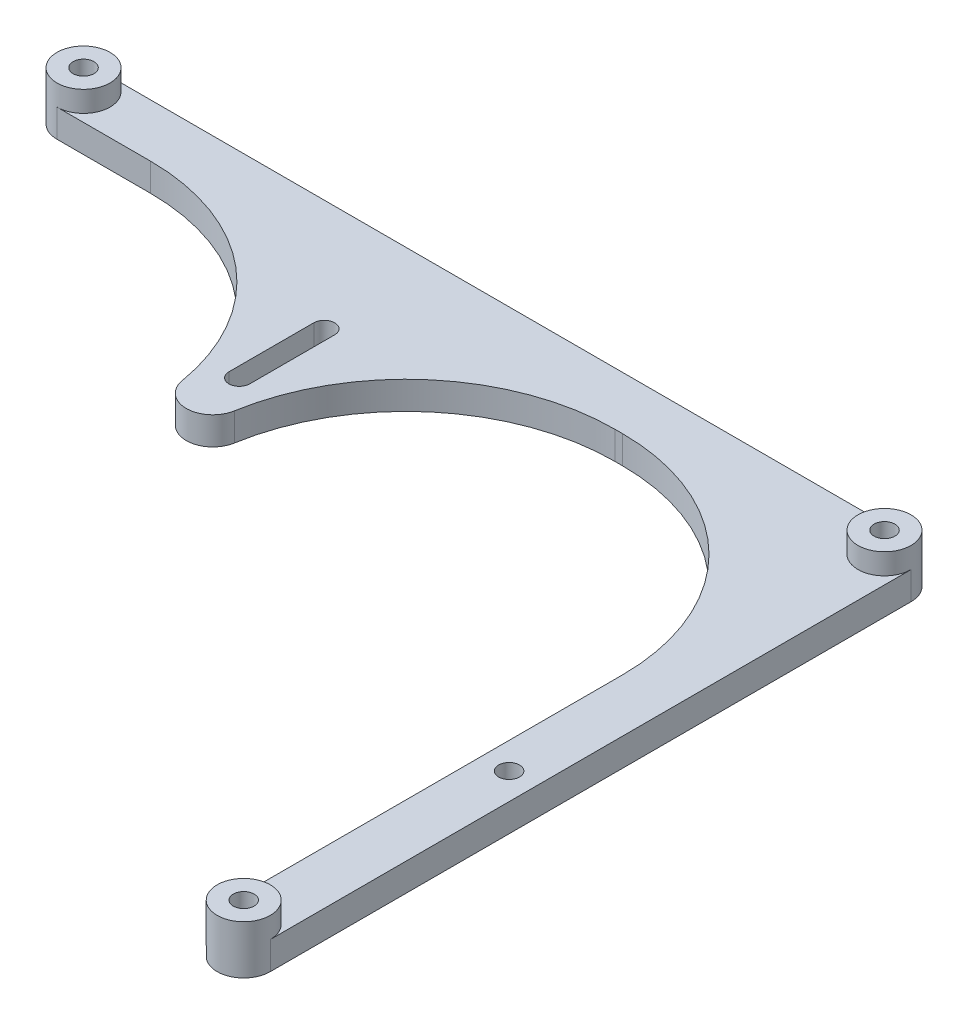
ISO-10303-21;
HEADER;
FILE_DESCRIPTION(('STEP AP214'),'2;1');
FILE_NAME('part.step','',(''),(''),'','','');
FILE_SCHEMA(('AUTOMOTIVE_DESIGN { 1 0 10303 214 1 1 1 1 }'));
ENDSEC;
DATA;
#1=APPLICATION_CONTEXT('core data for automotive mechanical design processes');
#2=APPLICATION_PROTOCOL_DEFINITION('international standard','automotive_design',2000,#1);
#3=PRODUCT_CONTEXT('',#1,'mechanical');
#4=PRODUCT('Part','Part','',(#3));
#5=PRODUCT_RELATED_PRODUCT_CATEGORY('part','',(#4));
#6=PRODUCT_DEFINITION_FORMATION('','',#4);
#7=PRODUCT_DEFINITION_CONTEXT('part definition',#1,'design');
#8=PRODUCT_DEFINITION('design','',#6,#7);
#9=PRODUCT_DEFINITION_SHAPE('','',#8);
#10=(LENGTH_UNIT() NAMED_UNIT(*) SI_UNIT(.MILLI.,.METRE.));
#11=(NAMED_UNIT(*) PLANE_ANGLE_UNIT() SI_UNIT($,.RADIAN.));
#12=(NAMED_UNIT(*) SI_UNIT($,.STERADIAN.) SOLID_ANGLE_UNIT());
#13=UNCERTAINTY_MEASURE_WITH_UNIT(LENGTH_MEASURE(1.E-05),#10,'distance_accuracy_value','');
#14=(GEOMETRIC_REPRESENTATION_CONTEXT(3) GLOBAL_UNCERTAINTY_ASSIGNED_CONTEXT((#13)) GLOBAL_UNIT_ASSIGNED_CONTEXT((#10,
#11,#12)) REPRESENTATION_CONTEXT('',''));
#15=CARTESIAN_POINT('',(0.,0.,0.));
#16=DIRECTION('',(0.,0.,1.));
#17=DIRECTION('',(1.,0.,0.));
#18=AXIS2_PLACEMENT_3D('',#15,#16,#17);
#19=CARTESIAN_POINT('',(0.,4.,0.));
#20=DIRECTION('',(0.,1.,0.));
#21=DIRECTION('',(0.,0.,1.));
#22=AXIS2_PLACEMENT_3D('',#19,#20,#21);
#23=PLANE('',#22);
#24=CARTESIAN_POINT('',(0.,4.,7.89999999999999));
#25=DIRECTION('',(0.,1.,0.));
#26=DIRECTION('',(0.,0.,1.));
#27=AXIS2_PLACEMENT_3D('',#24,#25,#26);
#28=CIRCLE('',#27,1.5);
#29=CARTESIAN_POINT('',(0.,4.,9.4));
#30=VERTEX_POINT('',#29);
#31=EDGE_CURVE('E157',#30,#30,#28,.T.);
#32=ORIENTED_EDGE('',*,*,#31,.F.);
#33=EDGE_LOOP('',(#32));
#34=FACE_BOUND('',#33,.T.);
#35=DIRECTION('',(0.,0.,1.));
#36=VECTOR('',#35,1.);
#37=CARTESIAN_POINT('',(-66.75,4.,0.));
#38=LINE('',#37,#36);
#39=CARTESIAN_POINT('',(-66.75,4.,-33.81));
#40=VERTEX_POINT('',#39);
#41=CARTESIAN_POINT('',(-66.75,4.,-21.62));
#42=VERTEX_POINT('',#41);
#43=EDGE_CURVE('E194',#40,#42,#38,.T.);
#44=ORIENTED_EDGE('',*,*,#43,.T.);
#45=CARTESIAN_POINT('',(-68.25,4.,-21.62));
#46=DIRECTION('',(0.,1.,0.));
#47=DIRECTION('',(0.,0.,1.));
#48=AXIS2_PLACEMENT_3D('',#45,#46,#47);
#49=CIRCLE('',#48,1.5);
#50=CARTESIAN_POINT('',(-69.75,4.,-21.62));
#51=VERTEX_POINT('',#50);
#52=EDGE_CURVE('E196',#51,#42,#49,.T.);
#53=ORIENTED_EDGE('',*,*,#52,.F.);
#54=DIRECTION('',(0.,0.,1.));
#55=VECTOR('',#54,1.);
#56=CARTESIAN_POINT('',(-69.75,4.,0.));
#57=LINE('',#56,#55);
#58=CARTESIAN_POINT('',(-69.75,4.,-33.81));
#59=VERTEX_POINT('',#58);
#60=EDGE_CURVE('E200',#59,#51,#57,.T.);
#61=ORIENTED_EDGE('',*,*,#60,.F.);
#62=CARTESIAN_POINT('',(-68.25,4.,-33.81));
#63=DIRECTION('',(0.,1.,0.));
#64=DIRECTION('',(0.,0.,1.));
#65=AXIS2_PLACEMENT_3D('',#62,#63,#64);
#66=CIRCLE('',#65,1.5);
#67=EDGE_CURVE('E203',#40,#59,#66,.T.);
#68=ORIENTED_EDGE('',*,*,#67,.F.);
#69=EDGE_LOOP('',(#44,#53,#61,#68));
#70=FACE_BOUND('',#69,.T.);
#71=DIRECTION('',(0.,0.,-1.));
#72=VECTOR('',#71,1.);
#73=CARTESIAN_POINT('',(-3.81,4.,0.));
#74=LINE('',#73,#72);
#75=CARTESIAN_POINT('',(-3.81,4.,46.));
#76=VERTEX_POINT('',#75);
#77=CARTESIAN_POINT('',(-3.81,4.,-12.19));
#78=VERTEX_POINT('',#77);
#79=EDGE_CURVE('E158',#76,#78,#74,.T.);
#80=ORIENTED_EDGE('',*,*,#79,.F.);
#81=CARTESIAN_POINT('',(0.,4.,46.));
#82=DIRECTION('',(0.,1.,0.));
#83=DIRECTION('',(0.,0.,1.));
#84=AXIS2_PLACEMENT_3D('',#81,#82,#83);
#85=CIRCLE('',#84,3.80999999999999);
#86=CARTESIAN_POINT('',(3.81,4.,46.));
#87=VERTEX_POINT('',#86);
#88=EDGE_CURVE('E164',#76,#87,#85,.F.);
#89=ORIENTED_EDGE('',*,*,#88,.T.);
#90=DIRECTION('',(0.,0.,-1.));
#91=VECTOR('',#90,1.);
#92=CARTESIAN_POINT('',(3.81,4.,0.));
#93=LINE('',#92,#91);
#94=CARTESIAN_POINT('',(3.81,4.,-46.));
#95=VERTEX_POINT('',#94);
#96=EDGE_CURVE('E149',#87,#95,#93,.T.);
#97=ORIENTED_EDGE('',*,*,#96,.T.);
#98=CARTESIAN_POINT('',(0.,4.,-46.));
#99=DIRECTION('',(0.,1.,0.));
#100=DIRECTION('',(0.,0.,1.));
#101=AXIS2_PLACEMENT_3D('',#98,#99,#100);
#102=CIRCLE('',#101,3.81);
#103=CARTESIAN_POINT('',(0.,4.,-49.81));
#104=VERTEX_POINT('',#103);
#105=EDGE_CURVE('E182',#95,#104,#102,.F.);
#106=ORIENTED_EDGE('',*,*,#105,.T.);
#107=DIRECTION('',(-1.,0.,0.));
#108=VECTOR('',#107,1.);
#109=CARTESIAN_POINT('',(0.,4.,-49.81));
#110=LINE('',#109,#108);
#111=CARTESIAN_POINT('',(-115.,4.,-49.81));
#112=VERTEX_POINT('',#111);
#113=EDGE_CURVE('E206',#104,#112,#110,.T.);
#114=ORIENTED_EDGE('',*,*,#113,.T.);
#115=CARTESIAN_POINT('',(-115.,4.,-46.));
#116=DIRECTION('',(0.,1.,0.));
#117=DIRECTION('',(0.,0.,1.));
#118=AXIS2_PLACEMENT_3D('',#115,#116,#117);
#119=CIRCLE('',#118,3.81000000000001);
#120=CARTESIAN_POINT('',(-115.,4.,-42.19));
#121=VERTEX_POINT('',#120);
#122=EDGE_CURVE('E190',#112,#121,#119,.F.);
#123=ORIENTED_EDGE('',*,*,#122,.T.);
#124=DIRECTION('',(-1.,0.,0.));
#125=VECTOR('',#124,1.);
#126=CARTESIAN_POINT('',(0.,4.,-42.19));
#127=LINE('',#126,#125);
#128=CARTESIAN_POINT('',(-101.589641569759,4.,-42.19));
#129=VERTEX_POINT('',#128);
#130=EDGE_CURVE('E209',#129,#121,#127,.T.);
#131=ORIENTED_EDGE('',*,*,#130,.F.);
#132=CARTESIAN_POINT('',(-101.589641569759,4.,-12.19));
#133=DIRECTION('',(0.,1.,0.));
#134=DIRECTION('',(0.,0.,1.));
#135=AXIS2_PLACEMENT_3D('',#132,#133,#134);
#136=CIRCLE('',#135,30.);
#137=CARTESIAN_POINT('',(-72.0069959887839,4.,-17.1766903283052));
#138=VERTEX_POINT('',#137);
#139=EDGE_CURVE('E303',#129,#138,#136,.F.);
#140=ORIENTED_EDGE('',*,*,#139,.T.);
#141=CARTESIAN_POINT('',(-68.25,4.,-17.81));
#142=DIRECTION('',(0.,1.,0.));
#143=DIRECTION('',(0.,0.,1.));
#144=AXIS2_PLACEMENT_3D('',#141,#142,#143);
#145=CIRCLE('',#144,3.81000000000001);
#146=CARTESIAN_POINT('',(-64.4930040112161,4.,-17.1766903283052));
#147=VERTEX_POINT('',#146);
#148=EDGE_CURVE('E211',#138,#147,#145,.T.);
#149=ORIENTED_EDGE('',*,*,#148,.T.);
#150=CARTESIAN_POINT('',(-34.910358430241,4.,-12.19));
#151=DIRECTION('',(0.,1.,0.));
#152=DIRECTION('',(0.,0.,1.));
#153=AXIS2_PLACEMENT_3D('',#150,#151,#152);
#154=CIRCLE('',#153,30.);
#155=CARTESIAN_POINT('',(-34.910358430241,4.,-42.19));
#156=VERTEX_POINT('',#155);
#157=EDGE_CURVE('E299',#147,#156,#154,.F.);
#158=ORIENTED_EDGE('',*,*,#157,.T.);
#159=DIRECTION('',(-1.,0.,0.));
#160=VECTOR('',#159,1.);
#161=CARTESIAN_POINT('',(0.,4.,-42.19));
#162=LINE('',#161,#160);
#163=CARTESIAN_POINT('',(-33.81,4.,-42.19));
#164=VERTEX_POINT('',#163);
#165=EDGE_CURVE('E214',#164,#156,#162,.T.);
#166=ORIENTED_EDGE('',*,*,#165,.F.);
#167=CARTESIAN_POINT('',(-33.81,4.,-12.19));
#168=DIRECTION('',(0.,1.,0.));
#169=DIRECTION('',(0.,0.,1.));
#170=AXIS2_PLACEMENT_3D('',#167,#168,#169);
#171=CIRCLE('',#170,30.);
#172=EDGE_CURVE('E11',#164,#78,#171,.F.);
#173=ORIENTED_EDGE('',*,*,#172,.T.);
#174=EDGE_LOOP('',(#80,#89,#97,#106,#114,#123,#131,#140,#149,#158,#166,#173));
#175=FACE_BOUND('',#174,.T.);
#176=ADVANCED_FACE('F35',(#34,#70,#175),#23,.T.);
#177=CARTESIAN_POINT('',(0.,4.,-46.));
#178=DIRECTION('',(0.,-1.,0.));
#179=DIRECTION('',(0.,0.,-1.));
#180=AXIS2_PLACEMENT_3D('',#177,#178,#179);
#181=CYLINDRICAL_SURFACE('',#180,3.81);
#182=CARTESIAN_POINT('',(0.,0.,-46.));
#183=DIRECTION('',(0.,1.,0.));
#184=DIRECTION('',(0.,0.,1.));
#185=AXIS2_PLACEMENT_3D('',#182,#183,#184);
#186=CIRCLE('',#185,3.81);
#187=CARTESIAN_POINT('',(3.81,0.,-46.));
#188=VERTEX_POINT('',#187);
#189=CARTESIAN_POINT('',(0.,0.,-49.81));
#190=VERTEX_POINT('',#189);
#191=EDGE_CURVE('E232',#188,#190,#186,.T.);
#192=ORIENTED_EDGE('',*,*,#191,.T.);
#193=DIRECTION('',(0.,-1.,0.));
#194=VECTOR('',#193,1.);
#195=CARTESIAN_POINT('',(0.,4.,-49.81));
#196=LINE('',#195,#194);
#197=EDGE_CURVE('E274',#104,#190,#196,.T.);
#198=ORIENTED_EDGE('',*,*,#197,.F.);
#199=ORIENTED_EDGE('',*,*,#105,.F.);
#200=DIRECTION('',(0.,-1.,0.));
#201=VECTOR('',#200,1.);
#202=CARTESIAN_POINT('',(3.81,4.,-46.));
#203=LINE('',#202,#201);
#204=EDGE_CURVE('E155',#95,#188,#203,.T.);
#205=ORIENTED_EDGE('',*,*,#204,.T.);
#206=EDGE_LOOP('',(#192,#198,#199,#205));
#207=FACE_BOUND('',#206,.T.);
#208=CARTESIAN_POINT('',(0.,7.,-46.));
#209=DIRECTION('',(0.,1.,0.));
#210=DIRECTION('',(0.,0.,1.));
#211=AXIS2_PLACEMENT_3D('',#208,#209,#210);
#212=CIRCLE('',#211,3.81);
#213=CARTESIAN_POINT('',(0.,7.,-42.19));
#214=VERTEX_POINT('',#213);
#215=EDGE_CURVE('E173',#214,#214,#212,.T.);
#216=ORIENTED_EDGE('',*,*,#215,.F.);
#217=EDGE_LOOP('',(#216));
#218=FACE_BOUND('',#217,.T.);
#219=ADVANCED_FACE('F316',(#207,#218),#181,.T.);
#220=CARTESIAN_POINT('',(0.,4.,-49.81));
#221=DIRECTION('',(0.,0.,1.));
#222=DIRECTION('',(1.,0.,0.));
#223=AXIS2_PLACEMENT_3D('',#220,#221,#222);
#224=PLANE('',#223);
#225=DIRECTION('',(-1.,0.,0.));
#226=VECTOR('',#225,1.);
#227=CARTESIAN_POINT('',(0.,0.,-49.81));
#228=LINE('',#227,#226);
#229=CARTESIAN_POINT('',(-115.,0.,-49.81));
#230=VERTEX_POINT('',#229);
#231=EDGE_CURVE('E235',#190,#230,#228,.T.);
#232=ORIENTED_EDGE('',*,*,#231,.T.);
#233=DIRECTION('',(0.,-1.,0.));
#234=VECTOR('',#233,1.);
#235=CARTESIAN_POINT('',(-115.,4.,-49.81));
#236=LINE('',#235,#234);
#237=EDGE_CURVE('E271',#112,#230,#236,.T.);
#238=ORIENTED_EDGE('',*,*,#237,.F.);
#239=ORIENTED_EDGE('',*,*,#113,.F.);
#240=ORIENTED_EDGE('',*,*,#197,.T.);
#241=EDGE_LOOP('',(#232,#238,#239,#240));
#242=FACE_BOUND('',#241,.T.);
#243=ADVANCED_FACE('F322',(#242),#224,.F.);
#244=CARTESIAN_POINT('',(-115.,4.,-46.));
#245=DIRECTION('',(0.,-1.,0.));
#246=DIRECTION('',(0.,0.,-1.));
#247=AXIS2_PLACEMENT_3D('',#244,#245,#246);
#248=CYLINDRICAL_SURFACE('',#247,3.81000000000001);
#249=CARTESIAN_POINT('',(-115.,0.,-46.));
#250=DIRECTION('',(0.,1.,0.));
#251=DIRECTION('',(0.,0.,1.));
#252=AXIS2_PLACEMENT_3D('',#249,#250,#251);
#253=CIRCLE('',#252,3.81000000000001);
#254=CARTESIAN_POINT('',(-115.,0.,-42.19));
#255=VERTEX_POINT('',#254);
#256=EDGE_CURVE('E237',#230,#255,#253,.T.);
#257=ORIENTED_EDGE('',*,*,#256,.T.);
#258=DIRECTION('',(0.,-1.,0.));
#259=VECTOR('',#258,1.);
#260=CARTESIAN_POINT('',(-115.,4.,-42.19));
#261=LINE('',#260,#259);
#262=EDGE_CURVE('E268',#121,#255,#261,.T.);
#263=ORIENTED_EDGE('',*,*,#262,.F.);
#264=ORIENTED_EDGE('',*,*,#122,.F.);
#265=ORIENTED_EDGE('',*,*,#237,.T.);
#266=EDGE_LOOP('',(#257,#263,#264,#265));
#267=FACE_BOUND('',#266,.T.);
#268=CARTESIAN_POINT('',(-115.,7.,-46.));
#269=DIRECTION('',(0.,1.,0.));
#270=DIRECTION('',(0.,0.,1.));
#271=AXIS2_PLACEMENT_3D('',#268,#269,#270);
#272=CIRCLE('',#271,3.81000000000001);
#273=CARTESIAN_POINT('',(-115.,7.,-42.19));
#274=VERTEX_POINT('',#273);
#275=EDGE_CURVE('E187',#274,#274,#272,.T.);
#276=ORIENTED_EDGE('',*,*,#275,.F.);
#277=EDGE_LOOP('',(#276));
#278=FACE_BOUND('',#277,.T.);
#279=ADVANCED_FACE('F325',(#267,#278),#248,.T.);
#280=CARTESIAN_POINT('',(0.,4.,-42.19));
#281=DIRECTION('',(0.,0.,1.));
#282=DIRECTION('',(1.,0.,0.));
#283=AXIS2_PLACEMENT_3D('',#280,#281,#282);
#284=PLANE('',#283);
#285=DIRECTION('',(-1.,0.,0.));
#286=VECTOR('',#285,1.);
#287=CARTESIAN_POINT('',(0.,0.,-42.19));
#288=LINE('',#287,#286);
#289=CARTESIAN_POINT('',(-101.589641569759,0.,-42.19));
#290=VERTEX_POINT('',#289);
#291=EDGE_CURVE('E240',#290,#255,#288,.T.);
#292=ORIENTED_EDGE('',*,*,#291,.F.);
#293=DIRECTION('',(0.,-1.,0.));
#294=VECTOR('',#293,1.);
#295=CARTESIAN_POINT('',(-101.589641569759,4.,-42.19));
#296=LINE('',#295,#294);
#297=EDGE_CURVE('E293',#290,#129,#296,.F.);
#298=ORIENTED_EDGE('',*,*,#297,.T.);
#299=ORIENTED_EDGE('',*,*,#130,.T.);
#300=ORIENTED_EDGE('',*,*,#262,.T.);
#301=EDGE_LOOP('',(#292,#298,#299,#300));
#302=FACE_BOUND('',#301,.T.);
#303=ADVANCED_FACE('F332',(#302),#284,.T.);
#304=CARTESIAN_POINT('',(-68.25,4.,-17.81));
#305=DIRECTION('',(0.,-1.,0.));
#306=DIRECTION('',(0.,0.,-1.));
#307=AXIS2_PLACEMENT_3D('',#304,#305,#306);
#308=CYLINDRICAL_SURFACE('',#307,3.81000000000001);
#309=CARTESIAN_POINT('',(-68.25,0.,-17.81));
#310=DIRECTION('',(0.,1.,0.));
#311=DIRECTION('',(0.,0.,1.));
#312=AXIS2_PLACEMENT_3D('',#309,#310,#311);
#313=CIRCLE('',#312,3.81000000000001);
#314=CARTESIAN_POINT('',(-72.0069959887839,0.,-17.1766903283052));
#315=VERTEX_POINT('',#314);
#316=CARTESIAN_POINT('',(-64.4930040112161,0.,-17.1766903283052));
#317=VERTEX_POINT('',#316);
#318=EDGE_CURVE('E242',#315,#317,#313,.T.);
#319=ORIENTED_EDGE('',*,*,#318,.T.);
#320=DIRECTION('',(0.,-1.,0.));
#321=VECTOR('',#320,1.);
#322=CARTESIAN_POINT('',(-64.4930040112161,4.,-17.1766903283052));
#323=LINE('',#322,#321);
#324=EDGE_CURVE('E291',#317,#147,#323,.F.);
#325=ORIENTED_EDGE('',*,*,#324,.T.);
#326=ORIENTED_EDGE('',*,*,#148,.F.);
#327=DIRECTION('',(0.,-1.,0.));
#328=VECTOR('',#327,1.);
#329=CARTESIAN_POINT('',(-72.0069959887839,4.,-17.1766903283052));
#330=LINE('',#329,#328);
#331=EDGE_CURVE('E288',#138,#315,#330,.T.);
#332=ORIENTED_EDGE('',*,*,#331,.T.);
#333=EDGE_LOOP('',(#319,#325,#326,#332));
#334=FACE_BOUND('',#333,.T.);
#335=ADVANCED_FACE('F340',(#334),#308,.T.);
#336=CARTESIAN_POINT('',(0.,4.,-42.19));
#337=DIRECTION('',(0.,0.,1.));
#338=DIRECTION('',(1.,0.,0.));
#339=AXIS2_PLACEMENT_3D('',#336,#337,#338);
#340=PLANE('',#339);
#341=ORIENTED_EDGE('',*,*,#165,.T.);
#342=DIRECTION('',(0.,-1.,0.));
#343=VECTOR('',#342,1.);
#344=CARTESIAN_POINT('',(-34.910358430241,4.,-42.19));
#345=LINE('',#344,#343);
#346=CARTESIAN_POINT('',(-34.910358430241,0.,-42.19));
#347=VERTEX_POINT('',#346);
#348=EDGE_CURVE('E285',#156,#347,#345,.T.);
#349=ORIENTED_EDGE('',*,*,#348,.T.);
#350=DIRECTION('',(-1.,0.,0.));
#351=VECTOR('',#350,1.);
#352=CARTESIAN_POINT('',(0.,0.,-42.19));
#353=LINE('',#352,#351);
#354=CARTESIAN_POINT('',(-33.81,0.,-42.19));
#355=VERTEX_POINT('',#354);
#356=EDGE_CURVE('E245',#355,#347,#353,.T.);
#357=ORIENTED_EDGE('',*,*,#356,.F.);
#358=DIRECTION('',(0.,-1.,0.));
#359=VECTOR('',#358,1.);
#360=CARTESIAN_POINT('',(-33.81,4.,-42.19));
#361=LINE('',#360,#359);
#362=EDGE_CURVE('E277',#355,#164,#361,.F.);
#363=ORIENTED_EDGE('',*,*,#362,.T.);
#364=EDGE_LOOP('',(#341,#349,#357,#363));
#365=FACE_BOUND('',#364,.T.);
#366=ADVANCED_FACE('F310',(#365),#340,.T.);
#367=CARTESIAN_POINT('',(-3.81,4.,0.));
#368=DIRECTION('',(-1.,0.,0.));
#369=DIRECTION('',(0.,0.,1.));
#370=AXIS2_PLACEMENT_3D('',#367,#368,#369);
#371=PLANE('',#370);
#372=ORIENTED_EDGE('',*,*,#79,.T.);
#373=DIRECTION('',(0.,-1.,0.));
#374=VECTOR('',#373,1.);
#375=CARTESIAN_POINT('',(-3.81,0.,-12.19));
#376=LINE('',#375,#374);
#377=CARTESIAN_POINT('',(-3.81,0.,-12.19));
#378=VERTEX_POINT('',#377);
#379=EDGE_CURVE('E295',#78,#378,#376,.T.);
#380=ORIENTED_EDGE('',*,*,#379,.T.);
#381=DIRECTION('',(0.,0.,-1.));
#382=VECTOR('',#381,1.);
#383=CARTESIAN_POINT('',(-3.81,0.,0.));
#384=LINE('',#383,#382);
#385=CARTESIAN_POINT('',(-3.81,0.,46.));
#386=VERTEX_POINT('',#385);
#387=EDGE_CURVE('E248',#386,#378,#384,.T.);
#388=ORIENTED_EDGE('',*,*,#387,.F.);
#389=DIRECTION('',(0.,-1.,0.));
#390=VECTOR('',#389,1.);
#391=CARTESIAN_POINT('',(-3.81,4.,46.));
#392=LINE('',#391,#390);
#393=EDGE_CURVE('E167',#76,#386,#392,.T.);
#394=ORIENTED_EDGE('',*,*,#393,.F.);
#395=EDGE_LOOP('',(#372,#380,#388,#394));
#396=FACE_BOUND('',#395,.T.);
#397=ADVANCED_FACE('F313',(#396),#371,.T.);
#398=CARTESIAN_POINT('',(0.,4.,46.));
#399=DIRECTION('',(0.,-1.,0.));
#400=DIRECTION('',(0.,0.,-1.));
#401=AXIS2_PLACEMENT_3D('',#398,#399,#400);
#402=CYLINDRICAL_SURFACE('',#401,3.80999999999999);
#403=CARTESIAN_POINT('',(0.,0.,46.));
#404=DIRECTION('',(0.,1.,0.));
#405=DIRECTION('',(0.,0.,1.));
#406=AXIS2_PLACEMENT_3D('',#403,#404,#405);
#407=CIRCLE('',#406,3.80999999999999);
#408=CARTESIAN_POINT('',(3.81,0.,46.));
#409=VERTEX_POINT('',#408);
#410=EDGE_CURVE('E166',#386,#409,#407,.T.);
#411=ORIENTED_EDGE('',*,*,#410,.T.);
#412=DIRECTION('',(0.,-1.,0.));
#413=VECTOR('',#412,1.);
#414=CARTESIAN_POINT('',(3.81,4.,46.));
#415=LINE('',#414,#413);
#416=EDGE_CURVE('E152',#87,#409,#415,.T.);
#417=ORIENTED_EDGE('',*,*,#416,.F.);
#418=ORIENTED_EDGE('',*,*,#88,.F.);
#419=ORIENTED_EDGE('',*,*,#393,.T.);
#420=EDGE_LOOP('',(#411,#417,#418,#419));
#421=FACE_BOUND('',#420,.T.);
#422=CARTESIAN_POINT('',(0.,7.,46.));
#423=DIRECTION('',(0.,1.,0.));
#424=DIRECTION('',(0.,0.,1.));
#425=AXIS2_PLACEMENT_3D('',#422,#423,#424);
#426=CIRCLE('',#425,3.80999999999999);
#427=CARTESIAN_POINT('',(0.,7.,49.81));
#428=VERTEX_POINT('',#427);
#429=EDGE_CURVE('E170',#428,#428,#426,.T.);
#430=ORIENTED_EDGE('',*,*,#429,.F.);
#431=EDGE_LOOP('',(#430));
#432=FACE_BOUND('',#431,.T.);
#433=ADVANCED_FACE('F162',(#421,#432),#402,.T.);
#434=CARTESIAN_POINT('',(-66.75,4.,0.));
#435=DIRECTION('',(1.,0.,0.));
#436=DIRECTION('',(0.,0.,-1.));
#437=AXIS2_PLACEMENT_3D('',#434,#435,#436);
#438=PLANE('',#437);
#439=DIRECTION('',(0.,0.,1.));
#440=VECTOR('',#439,1.);
#441=CARTESIAN_POINT('',(-66.75,0.,0.));
#442=LINE('',#441,#440);
#443=CARTESIAN_POINT('',(-66.75,0.,-33.81));
#444=VERTEX_POINT('',#443);
#445=CARTESIAN_POINT('',(-66.75,0.,-21.62));
#446=VERTEX_POINT('',#445);
#447=EDGE_CURVE('E193',#444,#446,#442,.T.);
#448=ORIENTED_EDGE('',*,*,#447,.T.);
#449=DIRECTION('',(0.,-1.,0.));
#450=VECTOR('',#449,1.);
#451=CARTESIAN_POINT('',(-66.75,4.,-21.62));
#452=LINE('',#451,#450);
#453=EDGE_CURVE('E265',#42,#446,#452,.T.);
#454=ORIENTED_EDGE('',*,*,#453,.F.);
#455=ORIENTED_EDGE('',*,*,#43,.F.);
#456=DIRECTION('',(0.,-1.,0.));
#457=VECTOR('',#456,1.);
#458=CARTESIAN_POINT('',(-66.75,4.,-33.81));
#459=LINE('',#458,#457);
#460=EDGE_CURVE('E220',#40,#444,#459,.T.);
#461=ORIENTED_EDGE('',*,*,#460,.T.);
#462=EDGE_LOOP('',(#448,#454,#455,#461));
#463=FACE_BOUND('',#462,.T.);
#464=ADVANCED_FACE('F393',(#463),#438,.F.);
#465=CARTESIAN_POINT('',(-68.25,4.,-21.62));
#466=DIRECTION('',(0.,-1.,0.));
#467=DIRECTION('',(0.,0.,-1.));
#468=AXIS2_PLACEMENT_3D('',#465,#466,#467);
#469=CYLINDRICAL_SURFACE('',#468,1.5);
#470=CARTESIAN_POINT('',(-68.25,0.,-21.62));
#471=DIRECTION('',(0.,1.,0.));
#472=DIRECTION('',(0.,0.,1.));
#473=AXIS2_PLACEMENT_3D('',#470,#471,#472);
#474=CIRCLE('',#473,1.5);
#475=CARTESIAN_POINT('',(-69.75,0.,-21.62));
#476=VERTEX_POINT('',#475);
#477=EDGE_CURVE('E223',#476,#446,#474,.T.);
#478=ORIENTED_EDGE('',*,*,#477,.F.);
#479=DIRECTION('',(0.,-1.,0.));
#480=VECTOR('',#479,1.);
#481=CARTESIAN_POINT('',(-69.75,4.,-21.62));
#482=LINE('',#481,#480);
#483=EDGE_CURVE('E281',#51,#476,#482,.T.);
#484=ORIENTED_EDGE('',*,*,#483,.F.);
#485=ORIENTED_EDGE('',*,*,#52,.T.);
#486=ORIENTED_EDGE('',*,*,#453,.T.);
#487=EDGE_LOOP('',(#478,#484,#485,#486));
#488=FACE_BOUND('',#487,.T.);
#489=ADVANCED_FACE('F411',(#488),#469,.F.);
#490=CARTESIAN_POINT('',(-69.75,4.,0.));
#491=DIRECTION('',(1.,0.,0.));
#492=DIRECTION('',(0.,0.,-1.));
#493=AXIS2_PLACEMENT_3D('',#490,#491,#492);
#494=PLANE('',#493);
#495=DIRECTION('',(0.,0.,1.));
#496=VECTOR('',#495,1.);
#497=CARTESIAN_POINT('',(-69.75,0.,0.));
#498=LINE('',#497,#496);
#499=CARTESIAN_POINT('',(-69.75,0.,-33.81));
#500=VERTEX_POINT('',#499);
#501=EDGE_CURVE('E226',#500,#476,#498,.T.);
#502=ORIENTED_EDGE('',*,*,#501,.F.);
#503=DIRECTION('',(0.,-1.,0.));
#504=VECTOR('',#503,1.);
#505=CARTESIAN_POINT('',(-69.75,4.,-33.81));
#506=LINE('',#505,#504);
#507=EDGE_CURVE('E279',#59,#500,#506,.T.);
#508=ORIENTED_EDGE('',*,*,#507,.F.);
#509=ORIENTED_EDGE('',*,*,#60,.T.);
#510=ORIENTED_EDGE('',*,*,#483,.T.);
#511=EDGE_LOOP('',(#502,#508,#509,#510));
#512=FACE_BOUND('',#511,.T.);
#513=ADVANCED_FACE('F380',(#512),#494,.T.);
#514=CARTESIAN_POINT('',(0.,4.,-46.));
#515=DIRECTION('',(0.,-1.,0.));
#516=DIRECTION('',(0.,0.,-1.));
#517=AXIS2_PLACEMENT_3D('',#514,#515,#516);
#518=CYLINDRICAL_SURFACE('',#517,1.5);
#519=CARTESIAN_POINT('',(0.,0.,-46.));
#520=DIRECTION('',(0.,1.,0.));
#521=DIRECTION('',(0.,0.,1.));
#522=AXIS2_PLACEMENT_3D('',#519,#520,#521);
#523=CIRCLE('',#522,1.5);
#524=CARTESIAN_POINT('',(0.,0.,-44.5));
#525=VERTEX_POINT('',#524);
#526=EDGE_CURVE('E260',#525,#525,#523,.T.);
#527=ORIENTED_EDGE('',*,*,#526,.F.);
#528=EDGE_LOOP('',(#527));
#529=FACE_BOUND('',#528,.T.);
#530=CARTESIAN_POINT('',(0.,7.,-46.));
#531=DIRECTION('',(0.,1.,0.));
#532=DIRECTION('',(0.,0.,1.));
#533=AXIS2_PLACEMENT_3D('',#530,#531,#532);
#534=CIRCLE('',#533,1.5);
#535=CARTESIAN_POINT('',(0.,7.,-44.5));
#536=VERTEX_POINT('',#535);
#537=EDGE_CURVE('E169',#536,#536,#534,.T.);
#538=ORIENTED_EDGE('',*,*,#537,.T.);
#539=EDGE_LOOP('',(#538));
#540=FACE_BOUND('',#539,.T.);
#541=ADVANCED_FACE('F376',(#529,#540),#518,.F.);
#542=CARTESIAN_POINT('',(0.,4.,46.));
#543=DIRECTION('',(0.,-1.,0.));
#544=DIRECTION('',(0.,0.,-1.));
#545=AXIS2_PLACEMENT_3D('',#542,#543,#544);
#546=CYLINDRICAL_SURFACE('',#545,1.5);
#547=CARTESIAN_POINT('',(0.,0.,46.));
#548=DIRECTION('',(0.,1.,0.));
#549=DIRECTION('',(0.,0.,1.));
#550=AXIS2_PLACEMENT_3D('',#547,#548,#549);
#551=CIRCLE('',#550,1.5);
#552=CARTESIAN_POINT('',(0.,0.,47.5));
#553=VERTEX_POINT('',#552);
#554=EDGE_CURVE('E257',#553,#553,#551,.T.);
#555=ORIENTED_EDGE('',*,*,#554,.F.);
#556=EDGE_LOOP('',(#555));
#557=FACE_BOUND('',#556,.T.);
#558=CARTESIAN_POINT('',(0.,7.,46.));
#559=DIRECTION('',(0.,1.,0.));
#560=DIRECTION('',(0.,0.,1.));
#561=AXIS2_PLACEMENT_3D('',#558,#559,#560);
#562=CIRCLE('',#561,1.5);
#563=CARTESIAN_POINT('',(0.,7.,47.5));
#564=VERTEX_POINT('',#563);
#565=EDGE_CURVE('E176',#564,#564,#562,.T.);
#566=ORIENTED_EDGE('',*,*,#565,.T.);
#567=EDGE_LOOP('',(#566));
#568=FACE_BOUND('',#567,.T.);
#569=ADVANCED_FACE('F379',(#557,#568),#546,.F.);
#570=CARTESIAN_POINT('',(0.,4.,7.89999999999999));
#571=DIRECTION('',(0.,-1.,0.));
#572=DIRECTION('',(0.,0.,-1.));
#573=AXIS2_PLACEMENT_3D('',#570,#571,#572);
#574=CYLINDRICAL_SURFACE('',#573,1.5);
#575=ORIENTED_EDGE('',*,*,#31,.T.);
#576=EDGE_LOOP('',(#575));
#577=FACE_BOUND('',#576,.T.);
#578=CARTESIAN_POINT('',(0.,0.,7.89999999999999));
#579=DIRECTION('',(0.,1.,0.));
#580=DIRECTION('',(0.,0.,1.));
#581=AXIS2_PLACEMENT_3D('',#578,#579,#580);
#582=CIRCLE('',#581,1.5);
#583=CARTESIAN_POINT('',(0.,0.,9.4));
#584=VERTEX_POINT('',#583);
#585=EDGE_CURVE('E254',#584,#584,#582,.T.);
#586=ORIENTED_EDGE('',*,*,#585,.F.);
#587=EDGE_LOOP('',(#586));
#588=FACE_BOUND('',#587,.T.);
#589=ADVANCED_FACE('F384',(#577,#588),#574,.F.);
#590=CARTESIAN_POINT('',(3.81,4.,0.));
#591=DIRECTION('',(-1.,0.,0.));
#592=DIRECTION('',(0.,0.,1.));
#593=AXIS2_PLACEMENT_3D('',#590,#591,#592);
#594=PLANE('',#593);
#595=DIRECTION('',(0.,0.,-1.));
#596=VECTOR('',#595,1.);
#597=CARTESIAN_POINT('',(3.81,0.,0.));
#598=LINE('',#597,#596);
#599=EDGE_CURVE('E252',#409,#188,#598,.T.);
#600=ORIENTED_EDGE('',*,*,#599,.T.);
#601=ORIENTED_EDGE('',*,*,#204,.F.);
#602=ORIENTED_EDGE('',*,*,#96,.F.);
#603=ORIENTED_EDGE('',*,*,#416,.T.);
#604=EDGE_LOOP('',(#600,#601,#602,#603));
#605=FACE_BOUND('',#604,.T.);
#606=ADVANCED_FACE('F151',(#605),#594,.F.);
#607=CARTESIAN_POINT('',(-68.25,4.,-33.81));
#608=DIRECTION('',(0.,-1.,0.));
#609=DIRECTION('',(0.,0.,-1.));
#610=AXIS2_PLACEMENT_3D('',#607,#608,#609);
#611=CYLINDRICAL_SURFACE('',#610,1.5);
#612=CARTESIAN_POINT('',(-68.25,0.,-33.81));
#613=DIRECTION('',(0.,1.,0.));
#614=DIRECTION('',(0.,0.,1.));
#615=AXIS2_PLACEMENT_3D('',#612,#613,#614);
#616=CIRCLE('',#615,1.5);
#617=EDGE_CURVE('E229',#444,#500,#616,.T.);
#618=ORIENTED_EDGE('',*,*,#617,.F.);
#619=ORIENTED_EDGE('',*,*,#460,.F.);
#620=ORIENTED_EDGE('',*,*,#67,.T.);
#621=ORIENTED_EDGE('',*,*,#507,.T.);
#622=EDGE_LOOP('',(#618,#619,#620,#621));
#623=FACE_BOUND('',#622,.T.);
#624=ADVANCED_FACE('F374',(#623),#611,.F.);
#625=CARTESIAN_POINT('',(-115.,4.,-46.));
#626=DIRECTION('',(0.,-1.,0.));
#627=DIRECTION('',(0.,0.,-1.));
#628=AXIS2_PLACEMENT_3D('',#625,#626,#627);
#629=CYLINDRICAL_SURFACE('',#628,1.5);
#630=CARTESIAN_POINT('',(-115.,0.,-46.));
#631=DIRECTION('',(0.,1.,0.));
#632=DIRECTION('',(0.,0.,1.));
#633=AXIS2_PLACEMENT_3D('',#630,#631,#632);
#634=CIRCLE('',#633,1.5);
#635=CARTESIAN_POINT('',(-115.,0.,-44.5));
#636=VERTEX_POINT('',#635);
#637=EDGE_CURVE('E197',#636,#636,#634,.T.);
#638=ORIENTED_EDGE('',*,*,#637,.F.);
#639=EDGE_LOOP('',(#638));
#640=FACE_BOUND('',#639,.T.);
#641=CARTESIAN_POINT('',(-115.,7.,-46.));
#642=DIRECTION('',(0.,1.,0.));
#643=DIRECTION('',(0.,0.,1.));
#644=AXIS2_PLACEMENT_3D('',#641,#642,#643);
#645=CIRCLE('',#644,1.5);
#646=CARTESIAN_POINT('',(-115.,7.,-44.5));
#647=VERTEX_POINT('',#646);
#648=EDGE_CURVE('E184',#647,#647,#645,.T.);
#649=ORIENTED_EDGE('',*,*,#648,.T.);
#650=EDGE_LOOP('',(#649));
#651=FACE_BOUND('',#650,.T.);
#652=ADVANCED_FACE('F371',(#640,#651),#629,.F.);
#653=CARTESIAN_POINT('',(0.,0.,0.));
#654=DIRECTION('',(0.,1.,0.));
#655=DIRECTION('',(0.,0.,1.));
#656=AXIS2_PLACEMENT_3D('',#653,#654,#655);
#657=PLANE('',#656);
#658=ORIENTED_EDGE('',*,*,#410,.F.);
#659=ORIENTED_EDGE('',*,*,#387,.T.);
#660=CARTESIAN_POINT('',(-33.81,0.,-12.19));
#661=DIRECTION('',(0.,1.,0.));
#662=DIRECTION('',(0.,0.,1.));
#663=AXIS2_PLACEMENT_3D('',#660,#661,#662);
#664=CIRCLE('',#663,30.);
#665=EDGE_CURVE('E43',#378,#355,#664,.T.);
#666=ORIENTED_EDGE('',*,*,#665,.T.);
#667=ORIENTED_EDGE('',*,*,#356,.T.);
#668=CARTESIAN_POINT('',(-34.910358430241,0.,-12.19));
#669=DIRECTION('',(0.,1.,0.));
#670=DIRECTION('',(0.,0.,1.));
#671=AXIS2_PLACEMENT_3D('',#668,#669,#670);
#672=CIRCLE('',#671,30.);
#673=EDGE_CURVE('E297',#347,#317,#672,.T.);
#674=ORIENTED_EDGE('',*,*,#673,.T.);
#675=ORIENTED_EDGE('',*,*,#318,.F.);
#676=CARTESIAN_POINT('',(-101.589641569759,0.,-12.19));
#677=DIRECTION('',(0.,1.,0.));
#678=DIRECTION('',(0.,0.,1.));
#679=AXIS2_PLACEMENT_3D('',#676,#677,#678);
#680=CIRCLE('',#679,30.);
#681=EDGE_CURVE('E301',#315,#290,#680,.T.);
#682=ORIENTED_EDGE('',*,*,#681,.T.);
#683=ORIENTED_EDGE('',*,*,#291,.T.);
#684=ORIENTED_EDGE('',*,*,#256,.F.);
#685=ORIENTED_EDGE('',*,*,#231,.F.);
#686=ORIENTED_EDGE('',*,*,#191,.F.);
#687=ORIENTED_EDGE('',*,*,#599,.F.);
#688=EDGE_LOOP('',(#658,#659,#666,#667,#674,#675,#682,#683,#684,#685,#686,#687));
#689=FACE_BOUND('',#688,.T.);
#690=ORIENTED_EDGE('',*,*,#554,.T.);
#691=EDGE_LOOP('',(#690));
#692=FACE_BOUND('',#691,.T.);
#693=ORIENTED_EDGE('',*,*,#526,.T.);
#694=EDGE_LOOP('',(#693));
#695=FACE_BOUND('',#694,.T.);
#696=ORIENTED_EDGE('',*,*,#637,.T.);
#697=EDGE_LOOP('',(#696));
#698=FACE_BOUND('',#697,.T.);
#699=ORIENTED_EDGE('',*,*,#585,.T.);
#700=EDGE_LOOP('',(#699));
#701=FACE_BOUND('',#700,.T.);
#702=ORIENTED_EDGE('',*,*,#447,.F.);
#703=ORIENTED_EDGE('',*,*,#617,.T.);
#704=ORIENTED_EDGE('',*,*,#501,.T.);
#705=ORIENTED_EDGE('',*,*,#477,.T.);
#706=EDGE_LOOP('',(#702,#703,#704,#705));
#707=FACE_BOUND('',#706,.T.);
#708=ADVANCED_FACE('F306',(#689,#692,#695,#698,#701,#707),#657,.F.);
#709=CARTESIAN_POINT('',(0.,7.,0.));
#710=DIRECTION('',(0.,1.,0.));
#711=DIRECTION('',(0.,0.,1.));
#712=AXIS2_PLACEMENT_3D('',#709,#710,#711);
#713=PLANE('',#712);
#714=ORIENTED_EDGE('',*,*,#648,.F.);
#715=EDGE_LOOP('',(#714));
#716=FACE_BOUND('',#715,.T.);
#717=ORIENTED_EDGE('',*,*,#275,.T.);
#718=EDGE_LOOP('',(#717));
#719=FACE_BOUND('',#718,.T.);
#720=ADVANCED_FACE('F367',(#716,#719),#713,.T.);
#721=CARTESIAN_POINT('',(0.,7.,0.));
#722=DIRECTION('',(0.,1.,0.));
#723=DIRECTION('',(0.,0.,1.));
#724=AXIS2_PLACEMENT_3D('',#721,#722,#723);
#725=PLANE('',#724);
#726=ORIENTED_EDGE('',*,*,#537,.F.);
#727=EDGE_LOOP('',(#726));
#728=FACE_BOUND('',#727,.T.);
#729=ORIENTED_EDGE('',*,*,#215,.T.);
#730=EDGE_LOOP('',(#729));
#731=FACE_BOUND('',#730,.T.);
#732=ADVANCED_FACE('F352',(#728,#731),#725,.T.);
#733=CARTESIAN_POINT('',(0.,7.,0.));
#734=DIRECTION('',(0.,1.,0.));
#735=DIRECTION('',(0.,0.,1.));
#736=AXIS2_PLACEMENT_3D('',#733,#734,#735);
#737=PLANE('',#736);
#738=ORIENTED_EDGE('',*,*,#565,.F.);
#739=EDGE_LOOP('',(#738));
#740=FACE_BOUND('',#739,.T.);
#741=ORIENTED_EDGE('',*,*,#429,.T.);
#742=EDGE_LOOP('',(#741));
#743=FACE_BOUND('',#742,.T.);
#744=ADVANCED_FACE('F346',(#740,#743),#737,.T.);
#745=CARTESIAN_POINT('',(-34.910358430241,4.,-12.19));
#746=DIRECTION('',(0.,-1.,0.));
#747=DIRECTION('',(0.,0.,-1.));
#748=AXIS2_PLACEMENT_3D('',#745,#746,#747);
#749=CYLINDRICAL_SURFACE('',#748,30.);
#750=ORIENTED_EDGE('',*,*,#157,.F.);
#751=ORIENTED_EDGE('',*,*,#324,.F.);
#752=ORIENTED_EDGE('',*,*,#673,.F.);
#753=ORIENTED_EDGE('',*,*,#348,.F.);
#754=EDGE_LOOP('',(#750,#751,#752,#753));
#755=FACE_BOUND('',#754,.T.);
#756=ADVANCED_FACE('F344',(#755),#749,.F.);
#757=CARTESIAN_POINT('',(-101.589641569759,4.,-12.19));
#758=DIRECTION('',(0.,-1.,0.));
#759=DIRECTION('',(0.,0.,-1.));
#760=AXIS2_PLACEMENT_3D('',#757,#758,#759);
#761=CYLINDRICAL_SURFACE('',#760,30.);
#762=ORIENTED_EDGE('',*,*,#139,.F.);
#763=ORIENTED_EDGE('',*,*,#297,.F.);
#764=ORIENTED_EDGE('',*,*,#681,.F.);
#765=ORIENTED_EDGE('',*,*,#331,.F.);
#766=EDGE_LOOP('',(#762,#763,#764,#765));
#767=FACE_BOUND('',#766,.T.);
#768=ADVANCED_FACE('F338',(#767),#761,.F.);
#769=CARTESIAN_POINT('',(-33.81,4.,-12.19));
#770=DIRECTION('',(0.,1.,0.));
#771=DIRECTION('',(0.,0.,1.));
#772=AXIS2_PLACEMENT_3D('',#769,#770,#771);
#773=CYLINDRICAL_SURFACE('',#772,30.);
#774=ORIENTED_EDGE('',*,*,#172,.F.);
#775=ORIENTED_EDGE('',*,*,#362,.F.);
#776=ORIENTED_EDGE('',*,*,#665,.F.);
#777=ORIENTED_EDGE('',*,*,#379,.F.);
#778=EDGE_LOOP('',(#774,#775,#776,#777));
#779=FACE_BOUND('',#778,.T.);
#780=ADVANCED_FACE('F37',(#779),#773,.F.);
#781=CLOSED_SHELL('',(#176,#219,#243,#279,#303,#335,#366,#397,#433,#464,#489,#513,#541,#569,
#589,#606,#624,#652,#708,#720,#732,#744,#756,#768,#780));
#782=MANIFOLD_SOLID_BREP('B2',#781);
#783=ADVANCED_BREP_SHAPE_REPRESENTATION('',(#18,#782),#14);
#784=SHAPE_DEFINITION_REPRESENTATION(#9,#783);
ENDSEC;
END-ISO-10303-21;
